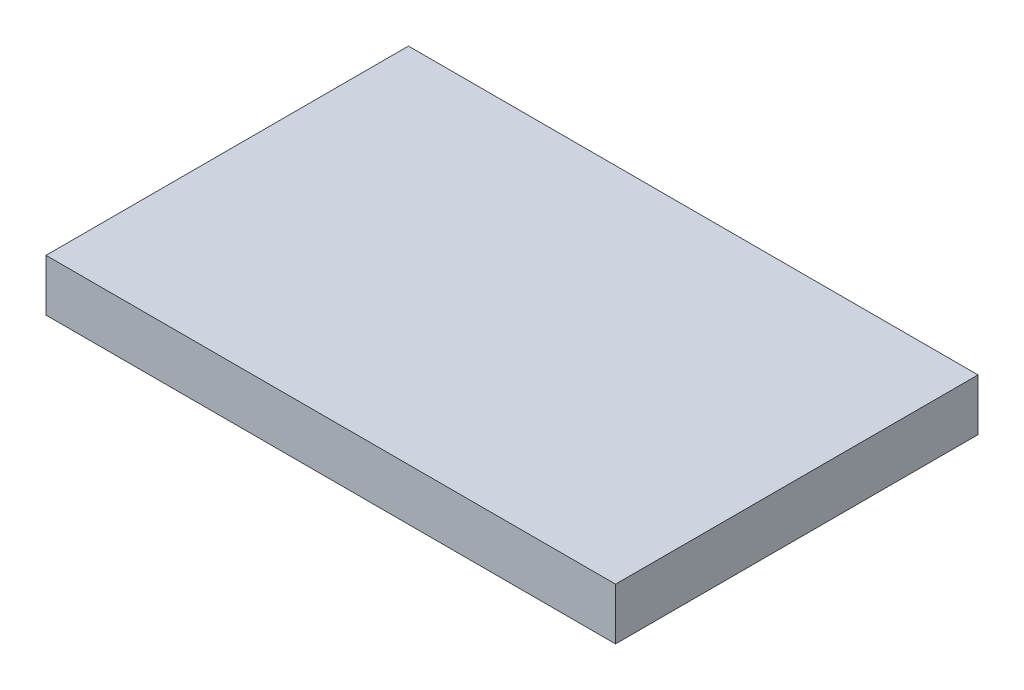
ISO-10303-21;
HEADER;
FILE_DESCRIPTION(('STEP AP214'),'2;1');
FILE_NAME('part.step','',(''),(''),'','','');
FILE_SCHEMA(('AUTOMOTIVE_DESIGN { 1 0 10303 214 1 1 1 1 }'));
ENDSEC;
DATA;
#1=APPLICATION_CONTEXT('core data for automotive mechanical design processes');
#2=APPLICATION_PROTOCOL_DEFINITION('international standard','automotive_design',2000,#1);
#3=PRODUCT_CONTEXT('',#1,'mechanical');
#4=PRODUCT('Part','Part','',(#3));
#5=PRODUCT_RELATED_PRODUCT_CATEGORY('part','',(#4));
#6=PRODUCT_DEFINITION_FORMATION('','',#4);
#7=PRODUCT_DEFINITION_CONTEXT('part definition',#1,'design');
#8=PRODUCT_DEFINITION('design','',#6,#7);
#9=PRODUCT_DEFINITION_SHAPE('','',#8);
#10=(LENGTH_UNIT() NAMED_UNIT(*) SI_UNIT(.MILLI.,.METRE.));
#11=(NAMED_UNIT(*) PLANE_ANGLE_UNIT() SI_UNIT($,.RADIAN.));
#12=(NAMED_UNIT(*) SI_UNIT($,.STERADIAN.) SOLID_ANGLE_UNIT());
#13=UNCERTAINTY_MEASURE_WITH_UNIT(LENGTH_MEASURE(1.E-05),#10,'distance_accuracy_value','');
#14=(GEOMETRIC_REPRESENTATION_CONTEXT(3) GLOBAL_UNCERTAINTY_ASSIGNED_CONTEXT((#13)) GLOBAL_UNIT_ASSIGNED_CONTEXT((#10,
#11,#12)) REPRESENTATION_CONTEXT('',''));
#15=CARTESIAN_POINT('',(0.,0.,0.));
#16=DIRECTION('',(0.,0.,1.));
#17=DIRECTION('',(1.,0.,0.));
#18=AXIS2_PLACEMENT_3D('',#15,#16,#17);
#19=CARTESIAN_POINT('',(279.4,25.4,0.));
#20=DIRECTION('',(-1.,0.,0.));
#21=DIRECTION('',(0.,0.,1.));
#22=AXIS2_PLACEMENT_3D('',#19,#20,#21);
#23=PLANE('',#22);
#24=DIRECTION('',(0.,1.,0.));
#25=VECTOR('',#24,1.);
#26=CARTESIAN_POINT('',(279.4,0.,25.4));
#27=LINE('',#26,#25);
#28=CARTESIAN_POINT('',(279.4,0.,25.4));
#29=VERTEX_POINT('',#28);
#30=CARTESIAN_POINT('',(279.4,25.4,25.4));
#31=VERTEX_POINT('',#30);
#32=EDGE_CURVE('E152',#29,#31,#27,.T.);
#33=ORIENTED_EDGE('',*,*,#32,.T.);
#34=DIRECTION('',(0.,0.,-1.));
#35=VECTOR('',#34,1.);
#36=CARTESIAN_POINT('',(279.4,25.4,0.));
#37=LINE('',#36,#35);
#38=CARTESIAN_POINT('',(279.4,25.4,203.2));
#39=VERTEX_POINT('',#38);
#40=EDGE_CURVE('E132',#39,#31,#37,.T.);
#41=ORIENTED_EDGE('',*,*,#40,.F.);
#42=DIRECTION('',(0.,-1.,0.));
#43=VECTOR('',#42,1.);
#44=CARTESIAN_POINT('',(279.4,25.4,203.2));
#45=LINE('',#44,#43);
#46=CARTESIAN_POINT('',(279.4,0.,203.2));
#47=VERTEX_POINT('',#46);
#48=EDGE_CURVE('E135',#39,#47,#45,.T.);
#49=ORIENTED_EDGE('',*,*,#48,.T.);
#50=DIRECTION('',(0.,0.,-1.));
#51=VECTOR('',#50,1.);
#52=CARTESIAN_POINT('',(279.4,0.,0.));
#53=LINE('',#52,#51);
#54=EDGE_CURVE('E121',#47,#29,#53,.T.);
#55=ORIENTED_EDGE('',*,*,#54,.T.);
#56=EDGE_LOOP('',(#33,#41,#49,#55));
#57=FACE_BOUND('',#56,.T.);
#58=ADVANCED_FACE('F40',(#57),#23,.F.);
#59=CARTESIAN_POINT('',(0.,25.4,0.));
#60=DIRECTION('',(0.,1.,0.));
#61=DIRECTION('',(0.,0.,1.));
#62=AXIS2_PLACEMENT_3D('',#59,#60,#61);
#63=PLANE('',#62);
#64=ORIENTED_EDGE('',*,*,#40,.T.);
#65=DIRECTION('',(-1.,0.,0.));
#66=VECTOR('',#65,1.);
#67=CARTESIAN_POINT('',(0.,25.4,25.4));
#68=LINE('',#67,#66);
#69=CARTESIAN_POINT('',(0.,25.4,25.4));
#70=VERTEX_POINT('',#69);
#71=EDGE_CURVE('E110',#31,#70,#68,.T.);
#72=ORIENTED_EDGE('',*,*,#71,.T.);
#73=DIRECTION('',(0.,0.,-1.));
#74=VECTOR('',#73,1.);
#75=CARTESIAN_POINT('',(0.,25.4,0.));
#76=LINE('',#75,#74);
#77=CARTESIAN_POINT('',(0.,25.4,203.2));
#78=VERTEX_POINT('',#77);
#79=EDGE_CURVE('E183',#78,#70,#76,.T.);
#80=ORIENTED_EDGE('',*,*,#79,.F.);
#81=DIRECTION('',(1.,0.,0.));
#82=VECTOR('',#81,1.);
#83=CARTESIAN_POINT('',(0.,25.4,203.2));
#84=LINE('',#83,#82);
#85=EDGE_CURVE('E64',#78,#39,#84,.T.);
#86=ORIENTED_EDGE('',*,*,#85,.T.);
#87=EDGE_LOOP('',(#64,#72,#80,#86));
#88=FACE_BOUND('',#87,.T.);
#89=ADVANCED_FACE('F175',(#88),#63,.T.);
#90=CARTESIAN_POINT('',(0.,0.,0.));
#91=DIRECTION('',(0.,1.,0.));
#92=DIRECTION('',(0.,0.,1.));
#93=AXIS2_PLACEMENT_3D('',#90,#91,#92);
#94=PLANE('',#93);
#95=DIRECTION('',(-1.,0.,0.));
#96=VECTOR('',#95,1.);
#97=CARTESIAN_POINT('',(0.,0.,25.4));
#98=LINE('',#97,#96);
#99=CARTESIAN_POINT('',(276.86,0.,25.4));
#100=VERTEX_POINT('',#99);
#101=EDGE_CURVE('E109',#29,#100,#98,.T.);
#102=ORIENTED_EDGE('',*,*,#101,.F.);
#103=ORIENTED_EDGE('',*,*,#54,.F.);
#104=DIRECTION('',(1.,0.,0.));
#105=VECTOR('',#104,1.);
#106=CARTESIAN_POINT('',(0.,0.,203.2));
#107=LINE('',#106,#105);
#108=CARTESIAN_POINT('',(0.,0.,203.2));
#109=VERTEX_POINT('',#108);
#110=EDGE_CURVE('E113',#109,#47,#107,.T.);
#111=ORIENTED_EDGE('',*,*,#110,.F.);
#112=DIRECTION('',(0.,0.,-1.));
#113=VECTOR('',#112,1.);
#114=CARTESIAN_POINT('',(0.,0.,0.));
#115=LINE('',#114,#113);
#116=CARTESIAN_POINT('',(0.,0.,200.66));
#117=VERTEX_POINT('',#116);
#118=EDGE_CURVE('E99',#109,#117,#115,.T.);
#119=ORIENTED_EDGE('',*,*,#118,.T.);
#120=DIRECTION('',(1.,0.,0.));
#121=VECTOR('',#120,1.);
#122=CARTESIAN_POINT('',(0.,0.,200.66));
#123=LINE('',#122,#121);
#124=CARTESIAN_POINT('',(276.86,0.,200.66));
#125=VERTEX_POINT('',#124);
#126=EDGE_CURVE('E149',#117,#125,#123,.T.);
#127=ORIENTED_EDGE('',*,*,#126,.T.);
#128=DIRECTION('',(0.,0.,-1.));
#129=VECTOR('',#128,1.);
#130=CARTESIAN_POINT('',(276.86,0.,0.));
#131=LINE('',#130,#129);
#132=EDGE_CURVE('E165',#125,#100,#131,.T.);
#133=ORIENTED_EDGE('',*,*,#132,.T.);
#134=EDGE_LOOP('',(#102,#103,#111,#119,#127,#133));
#135=FACE_BOUND('',#134,.T.);
#136=ADVANCED_FACE('F119',(#135),#94,.F.);
#137=CARTESIAN_POINT('',(276.86,25.4,0.));
#138=DIRECTION('',(-1.,0.,0.));
#139=DIRECTION('',(0.,0.,1.));
#140=AXIS2_PLACEMENT_3D('',#137,#138,#139);
#141=PLANE('',#140);
#142=DIRECTION('',(0.,0.,-1.));
#143=VECTOR('',#142,1.);
#144=CARTESIAN_POINT('',(276.86,22.86,0.));
#145=LINE('',#144,#143);
#146=CARTESIAN_POINT('',(276.86,22.86,200.66));
#147=VERTEX_POINT('',#146);
#148=CARTESIAN_POINT('',(276.86,22.86,25.4));
#149=VERTEX_POINT('',#148);
#150=EDGE_CURVE('E129',#147,#149,#145,.T.);
#151=ORIENTED_EDGE('',*,*,#150,.T.);
#152=DIRECTION('',(0.,-1.,0.));
#153=VECTOR('',#152,1.);
#154=CARTESIAN_POINT('',(276.86,25.4,25.4));
#155=LINE('',#154,#153);
#156=EDGE_CURVE('E151',#149,#100,#155,.T.);
#157=ORIENTED_EDGE('',*,*,#156,.T.);
#158=ORIENTED_EDGE('',*,*,#132,.F.);
#159=DIRECTION('',(0.,-1.,0.));
#160=VECTOR('',#159,1.);
#161=CARTESIAN_POINT('',(276.86,25.4,200.66));
#162=LINE('',#161,#160);
#163=EDGE_CURVE('E123',#147,#125,#162,.T.);
#164=ORIENTED_EDGE('',*,*,#163,.F.);
#165=EDGE_LOOP('',(#151,#157,#158,#164));
#166=FACE_BOUND('',#165,.T.);
#167=ADVANCED_FACE('F189',(#166),#141,.T.);
#168=CARTESIAN_POINT('',(0.,22.86,0.));
#169=DIRECTION('',(0.,1.,0.));
#170=DIRECTION('',(0.,0.,1.));
#171=AXIS2_PLACEMENT_3D('',#168,#169,#170);
#172=PLANE('',#171);
#173=DIRECTION('',(-1.,0.,0.));
#174=VECTOR('',#173,1.);
#175=CARTESIAN_POINT('',(0.,22.86,25.4));
#176=LINE('',#175,#174);
#177=CARTESIAN_POINT('',(0.,22.86,25.4));
#178=VERTEX_POINT('',#177);
#179=EDGE_CURVE('E11',#149,#178,#176,.T.);
#180=ORIENTED_EDGE('',*,*,#179,.F.);
#181=ORIENTED_EDGE('',*,*,#150,.F.);
#182=DIRECTION('',(1.,0.,0.));
#183=VECTOR('',#182,1.);
#184=CARTESIAN_POINT('',(0.,22.86,200.66));
#185=LINE('',#184,#183);
#186=CARTESIAN_POINT('',(0.,22.86,200.66));
#187=VERTEX_POINT('',#186);
#188=EDGE_CURVE('E145',#187,#147,#185,.T.);
#189=ORIENTED_EDGE('',*,*,#188,.F.);
#190=DIRECTION('',(0.,0.,-1.));
#191=VECTOR('',#190,1.);
#192=CARTESIAN_POINT('',(0.,22.86,0.));
#193=LINE('',#192,#191);
#194=EDGE_CURVE('E49',#187,#178,#193,.T.);
#195=ORIENTED_EDGE('',*,*,#194,.T.);
#196=EDGE_LOOP('',(#180,#181,#189,#195));
#197=FACE_BOUND('',#196,.T.);
#198=ADVANCED_FACE('F142',(#197),#172,.F.);
#199=CARTESIAN_POINT('',(0.,25.4,203.2));
#200=DIRECTION('',(0.,0.,-1.));
#201=DIRECTION('',(-1.,0.,0.));
#202=AXIS2_PLACEMENT_3D('',#199,#200,#201);
#203=PLANE('',#202);
#204=ORIENTED_EDGE('',*,*,#85,.F.);
#205=DIRECTION('',(0.,1.,0.));
#206=VECTOR('',#205,1.);
#207=CARTESIAN_POINT('',(0.,0.,203.2));
#208=LINE('',#207,#206);
#209=EDGE_CURVE('E102',#109,#78,#208,.T.);
#210=ORIENTED_EDGE('',*,*,#209,.F.);
#211=ORIENTED_EDGE('',*,*,#110,.T.);
#212=ORIENTED_EDGE('',*,*,#48,.F.);
#213=EDGE_LOOP('',(#204,#210,#211,#212));
#214=FACE_BOUND('',#213,.T.);
#215=ADVANCED_FACE('F42',(#214),#203,.F.);
#216=CARTESIAN_POINT('',(0.,25.4,200.66));
#217=DIRECTION('',(0.,0.,-1.));
#218=DIRECTION('',(-1.,0.,0.));
#219=AXIS2_PLACEMENT_3D('',#216,#217,#218);
#220=PLANE('',#219);
#221=DIRECTION('',(0.,-1.,0.));
#222=VECTOR('',#221,1.);
#223=CARTESIAN_POINT('',(0.,25.4,200.66));
#224=LINE('',#223,#222);
#225=EDGE_CURVE('E104',#187,#117,#224,.T.);
#226=ORIENTED_EDGE('',*,*,#225,.F.);
#227=ORIENTED_EDGE('',*,*,#188,.T.);
#228=ORIENTED_EDGE('',*,*,#163,.T.);
#229=ORIENTED_EDGE('',*,*,#126,.F.);
#230=EDGE_LOOP('',(#226,#227,#228,#229));
#231=FACE_BOUND('',#230,.T.);
#232=ADVANCED_FACE('F147',(#231),#220,.T.);
#233=CARTESIAN_POINT('',(0.,0.,25.4));
#234=DIRECTION('',(0.,0.,-1.));
#235=DIRECTION('',(-1.,0.,0.));
#236=AXIS2_PLACEMENT_3D('',#233,#234,#235);
#237=PLANE('',#236);
#238=ORIENTED_EDGE('',*,*,#179,.T.);
#239=DIRECTION('',(0.,1.,0.));
#240=VECTOR('',#239,1.);
#241=CARTESIAN_POINT('',(0.,0.,25.4));
#242=LINE('',#241,#240);
#243=EDGE_CURVE('E56',#178,#70,#242,.T.);
#244=ORIENTED_EDGE('',*,*,#243,.T.);
#245=ORIENTED_EDGE('',*,*,#71,.F.);
#246=ORIENTED_EDGE('',*,*,#32,.F.);
#247=ORIENTED_EDGE('',*,*,#101,.T.);
#248=ORIENTED_EDGE('',*,*,#156,.F.);
#249=EDGE_LOOP('',(#238,#244,#245,#246,#247,#248));
#250=FACE_BOUND('',#249,.T.);
#251=ADVANCED_FACE('F178',(#250),#237,.T.);
#252=CARTESIAN_POINT('',(0.,0.,0.));
#253=DIRECTION('',(1.,0.,0.));
#254=DIRECTION('',(0.,0.,-1.));
#255=AXIS2_PLACEMENT_3D('',#252,#253,#254);
#256=PLANE('',#255);
#257=ORIENTED_EDGE('',*,*,#225,.T.);
#258=ORIENTED_EDGE('',*,*,#118,.F.);
#259=ORIENTED_EDGE('',*,*,#209,.T.);
#260=ORIENTED_EDGE('',*,*,#79,.T.);
#261=ORIENTED_EDGE('',*,*,#243,.F.);
#262=ORIENTED_EDGE('',*,*,#194,.F.);
#263=EDGE_LOOP('',(#257,#258,#259,#260,#261,#262));
#264=FACE_BOUND('',#263,.T.);
#265=ADVANCED_FACE('F101',(#264),#256,.F.);
#266=CLOSED_SHELL('',(#58,#89,#136,#167,#198,#215,#232,#251,#265));
#267=MANIFOLD_SOLID_BREP('B2',#266);
#268=ADVANCED_BREP_SHAPE_REPRESENTATION('',(#18,#267),#14);
#269=SHAPE_DEFINITION_REPRESENTATION(#9,#268);
ENDSEC;
END-ISO-10303-21;
